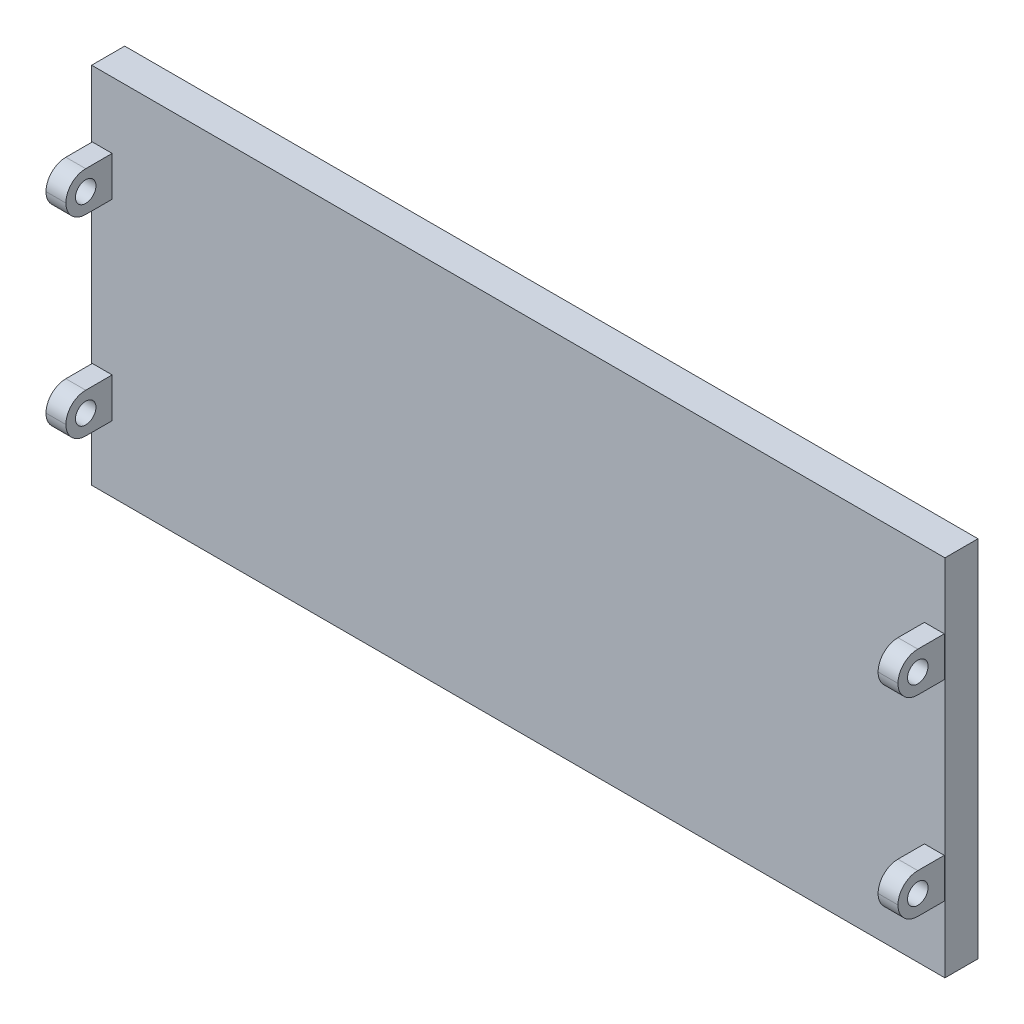
ISO-10303-21;
HEADER;
FILE_DESCRIPTION(('STEP AP214'),'2;1');
FILE_NAME('part.step','',(''),(''),'','','');
FILE_SCHEMA(('AUTOMOTIVE_DESIGN { 1 0 10303 214 1 1 1 1 }'));
ENDSEC;
DATA;
#1=APPLICATION_CONTEXT('core data for automotive mechanical design processes');
#2=APPLICATION_PROTOCOL_DEFINITION('international standard','automotive_design',2000,#1);
#3=PRODUCT_CONTEXT('',#1,'mechanical');
#4=PRODUCT('Part','Part','',(#3));
#5=PRODUCT_RELATED_PRODUCT_CATEGORY('part','',(#4));
#6=PRODUCT_DEFINITION_FORMATION('','',#4);
#7=PRODUCT_DEFINITION_CONTEXT('part definition',#1,'design');
#8=PRODUCT_DEFINITION('design','',#6,#7);
#9=PRODUCT_DEFINITION_SHAPE('','',#8);
#10=(LENGTH_UNIT() NAMED_UNIT(*) SI_UNIT(.MILLI.,.METRE.));
#11=(NAMED_UNIT(*) PLANE_ANGLE_UNIT() SI_UNIT($,.RADIAN.));
#12=(NAMED_UNIT(*) SI_UNIT($,.STERADIAN.) SOLID_ANGLE_UNIT());
#13=UNCERTAINTY_MEASURE_WITH_UNIT(LENGTH_MEASURE(1.E-05),#10,'distance_accuracy_value','');
#14=(GEOMETRIC_REPRESENTATION_CONTEXT(3) GLOBAL_UNCERTAINTY_ASSIGNED_CONTEXT((#13)) GLOBAL_UNIT_ASSIGNED_CONTEXT((#10,
#11,#12)) REPRESENTATION_CONTEXT('',''));
#15=CARTESIAN_POINT('',(0.,0.,0.));
#16=DIRECTION('',(0.,0.,1.));
#17=DIRECTION('',(1.,0.,0.));
#18=AXIS2_PLACEMENT_3D('',#15,#16,#17);
#19=CARTESIAN_POINT('',(225.,0.,0.));
#20=DIRECTION('',(-1.,0.,0.));
#21=DIRECTION('',(0.,0.,1.));
#22=AXIS2_PLACEMENT_3D('',#19,#20,#21);
#23=PLANE('',#22);
#24=DIRECTION('',(0.,0.,1.));
#25=VECTOR('',#24,1.);
#26=CARTESIAN_POINT('',(225.,0.,-4.99999999999999));
#27=LINE('',#26,#25);
#28=CARTESIAN_POINT('',(225.,0.,-4.99999999999999));
#29=VERTEX_POINT('',#28);
#30=CARTESIAN_POINT('',(225.,0.,0.));
#31=VERTEX_POINT('',#30);
#32=EDGE_CURVE('E207',#29,#31,#27,.T.);
#33=ORIENTED_EDGE('',*,*,#32,.T.);
#34=DIRECTION('',(0.,1.,0.));
#35=VECTOR('',#34,1.);
#36=CARTESIAN_POINT('',(225.,0.,0.));
#37=LINE('',#36,#35);
#38=CARTESIAN_POINT('',(225.,55.,0.));
#39=VERTEX_POINT('',#38);
#40=EDGE_CURVE('E41',#31,#39,#37,.T.);
#41=ORIENTED_EDGE('',*,*,#40,.T.);
#42=DIRECTION('',(0.,0.,-1.));
#43=VECTOR('',#42,1.);
#44=CARTESIAN_POINT('',(225.,55.,0.));
#45=LINE('',#44,#43);
#46=CARTESIAN_POINT('',(225.,55.,-4.99999999999998));
#47=VERTEX_POINT('',#46);
#48=EDGE_CURVE('E234',#39,#47,#45,.T.);
#49=ORIENTED_EDGE('',*,*,#48,.T.);
#50=DIRECTION('',(0.,-1.,0.));
#51=VECTOR('',#50,1.);
#52=CARTESIAN_POINT('',(225.,55.,-4.99999999999998));
#53=LINE('',#52,#51);
#54=EDGE_CURVE('E220',#47,#29,#53,.T.);
#55=ORIENTED_EDGE('',*,*,#54,.T.);
#56=EDGE_LOOP('',(#33,#41,#49,#55));
#57=FACE_BOUND('',#56,.T.);
#58=ADVANCED_FACE('F37',(#57),#23,.T.);
#59=CARTESIAN_POINT('',(354.,0.,0.));
#60=DIRECTION('',(1.,0.,0.));
#61=DIRECTION('',(0.,1.,0.));
#62=AXIS2_PLACEMENT_3D('',#59,#60,#61);
#63=PLANE('',#62);
#64=DIRECTION('',(0.,0.,1.));
#65=VECTOR('',#64,1.);
#66=CARTESIAN_POINT('',(354.,55.,0.));
#67=LINE('',#66,#65);
#68=CARTESIAN_POINT('',(354.,55.,-4.99999999999998));
#69=VERTEX_POINT('',#68);
#70=CARTESIAN_POINT('',(354.,55.,0.));
#71=VERTEX_POINT('',#70);
#72=EDGE_CURVE('E232',#69,#71,#67,.T.);
#73=ORIENTED_EDGE('',*,*,#72,.T.);
#74=DIRECTION('',(0.,-1.,0.));
#75=VECTOR('',#74,1.);
#76=CARTESIAN_POINT('',(354.,0.,0.));
#77=LINE('',#76,#75);
#78=CARTESIAN_POINT('',(354.,0.,0.));
#79=VERTEX_POINT('',#78);
#80=EDGE_CURVE('E225',#71,#79,#77,.T.);
#81=ORIENTED_EDGE('',*,*,#80,.T.);
#82=DIRECTION('',(0.,0.,-1.));
#83=VECTOR('',#82,1.);
#84=CARTESIAN_POINT('',(354.,0.,-4.99999999999999));
#85=LINE('',#84,#83);
#86=CARTESIAN_POINT('',(354.,0.,-4.99999999999999));
#87=VERTEX_POINT('',#86);
#88=EDGE_CURVE('E205',#79,#87,#85,.T.);
#89=ORIENTED_EDGE('',*,*,#88,.T.);
#90=DIRECTION('',(0.,1.,0.));
#91=VECTOR('',#90,1.);
#92=CARTESIAN_POINT('',(354.,55.,-4.99999999999998));
#93=LINE('',#92,#91);
#94=EDGE_CURVE('E215',#87,#69,#93,.T.);
#95=ORIENTED_EDGE('',*,*,#94,.T.);
#96=EDGE_LOOP('',(#73,#81,#89,#95));
#97=FACE_BOUND('',#96,.T.);
#98=ADVANCED_FACE('F223',(#97),#63,.T.);
#99=CARTESIAN_POINT('',(129.,42.,4.));
#100=DIRECTION('',(1.,0.,0.));
#101=DIRECTION('',(0.,0.,-1.));
#102=AXIS2_PLACEMENT_3D('',#99,#100,#101);
#103=CYLINDRICAL_SURFACE('',#102,3.);
#104=DIRECTION('',(-1.,0.,0.));
#105=VECTOR('',#104,1.);
#106=CARTESIAN_POINT('',(353.9,45.,4.));
#107=LINE('',#106,#105);
#108=CARTESIAN_POINT('',(350.9,45.,4.));
#109=VERTEX_POINT('',#108);
#110=CARTESIAN_POINT('',(353.9,45.,4.));
#111=VERTEX_POINT('',#110);
#112=EDGE_CURVE('E251',#109,#111,#107,.F.);
#113=ORIENTED_EDGE('',*,*,#112,.F.);
#114=CARTESIAN_POINT('',(350.9,42.,4.));
#115=DIRECTION('',(1.,0.,0.));
#116=DIRECTION('',(0.,0.,-1.));
#117=AXIS2_PLACEMENT_3D('',#114,#115,#116);
#118=CIRCLE('',#117,3.);
#119=CARTESIAN_POINT('',(350.9,42.,7.));
#120=VERTEX_POINT('',#119);
#121=EDGE_CURVE('E257',#120,#109,#118,.F.);
#122=ORIENTED_EDGE('',*,*,#121,.F.);
#123=DIRECTION('',(-1.,0.,0.));
#124=VECTOR('',#123,1.);
#125=CARTESIAN_POINT('',(350.9,42.,7.));
#126=LINE('',#125,#124);
#127=CARTESIAN_POINT('',(353.9,42.,7.));
#128=VERTEX_POINT('',#127);
#129=EDGE_CURVE('E11',#128,#120,#126,.T.);
#130=ORIENTED_EDGE('',*,*,#129,.F.);
#131=CARTESIAN_POINT('',(353.9,42.,4.));
#132=DIRECTION('',(-1.,0.,0.));
#133=DIRECTION('',(0.,0.,1.));
#134=AXIS2_PLACEMENT_3D('',#131,#132,#133);
#135=CIRCLE('',#134,3.);
#136=EDGE_CURVE('E267',#111,#128,#135,.F.);
#137=ORIENTED_EDGE('',*,*,#136,.F.);
#138=EDGE_LOOP('',(#113,#122,#130,#137));
#139=FACE_BOUND('',#138,.T.);
#140=ADVANCED_FACE('F439',(#139),#103,.T.);
#141=CARTESIAN_POINT('',(129.,42.,4.));
#142=DIRECTION('',(-1.,0.,0.));
#143=DIRECTION('',(0.,0.,1.));
#144=AXIS2_PLACEMENT_3D('',#141,#142,#143);
#145=CYLINDRICAL_SURFACE('',#144,3.);
#146=CARTESIAN_POINT('',(350.9,42.,4.));
#147=DIRECTION('',(1.,0.,0.));
#148=DIRECTION('',(0.,0.,-1.));
#149=AXIS2_PLACEMENT_3D('',#146,#147,#148);
#150=CIRCLE('',#149,3.);
#151=CARTESIAN_POINT('',(350.9,39.,4.));
#152=VERTEX_POINT('',#151);
#153=EDGE_CURVE('E252',#152,#120,#150,.F.);
#154=ORIENTED_EDGE('',*,*,#153,.F.);
#155=DIRECTION('',(1.,0.,0.));
#156=VECTOR('',#155,1.);
#157=CARTESIAN_POINT('',(350.9,39.,4.));
#158=LINE('',#157,#156);
#159=CARTESIAN_POINT('',(353.9,39.,4.));
#160=VERTEX_POINT('',#159);
#161=EDGE_CURVE('E262',#160,#152,#158,.F.);
#162=ORIENTED_EDGE('',*,*,#161,.F.);
#163=CARTESIAN_POINT('',(353.9,42.,4.));
#164=DIRECTION('',(-1.,0.,0.));
#165=DIRECTION('',(0.,0.,1.));
#166=AXIS2_PLACEMENT_3D('',#163,#164,#165);
#167=CIRCLE('',#166,3.);
#168=EDGE_CURVE('E265',#128,#160,#167,.F.);
#169=ORIENTED_EDGE('',*,*,#168,.F.);
#170=ORIENTED_EDGE('',*,*,#129,.T.);
#171=EDGE_LOOP('',(#154,#162,#169,#170));
#172=FACE_BOUND('',#171,.T.);
#173=ADVANCED_FACE('F436',(#172),#145,.T.);
#174=CARTESIAN_POINT('',(357.9,42.,4.));
#175=DIRECTION('',(-1.,0.,0.));
#176=DIRECTION('',(0.,-1.,0.));
#177=AXIS2_PLACEMENT_3D('',#174,#175,#176);
#178=CYLINDRICAL_SURFACE('',#177,1.55);
#179=CARTESIAN_POINT('',(350.9,42.,4.));
#180=DIRECTION('',(-1.,0.,0.));
#181=DIRECTION('',(0.,0.,1.));
#182=AXIS2_PLACEMENT_3D('',#179,#180,#181);
#183=CIRCLE('',#182,1.55);
#184=CARTESIAN_POINT('',(350.9,42.,5.55));
#185=VERTEX_POINT('',#184);
#186=EDGE_CURVE('E229',#185,#185,#183,.T.);
#187=ORIENTED_EDGE('',*,*,#186,.T.);
#188=EDGE_LOOP('',(#187));
#189=FACE_BOUND('',#188,.T.);
#190=CARTESIAN_POINT('',(353.9,42.,4.));
#191=DIRECTION('',(-1.,0.,0.));
#192=DIRECTION('',(0.,0.,1.));
#193=AXIS2_PLACEMENT_3D('',#190,#191,#192);
#194=CIRCLE('',#193,1.55);
#195=CARTESIAN_POINT('',(353.9,42.,5.55));
#196=VERTEX_POINT('',#195);
#197=EDGE_CURVE('E283',#196,#196,#194,.T.);
#198=ORIENTED_EDGE('',*,*,#197,.F.);
#199=EDGE_LOOP('',(#198));
#200=FACE_BOUND('',#199,.T.);
#201=ADVANCED_FACE('F413',(#189,#200),#178,.F.);
#202=CARTESIAN_POINT('',(228.1,13.,4.));
#203=DIRECTION('',(-1.,0.,0.));
#204=DIRECTION('',(0.,0.,1.));
#205=AXIS2_PLACEMENT_3D('',#202,#203,#204);
#206=CYLINDRICAL_SURFACE('',#205,3.);
#207=CARTESIAN_POINT('',(228.1,13.,4.));
#208=DIRECTION('',(1.,0.,0.));
#209=DIRECTION('',(0.,0.,-1.));
#210=AXIS2_PLACEMENT_3D('',#207,#208,#209);
#211=CIRCLE('',#210,3.);
#212=CARTESIAN_POINT('',(228.1,13.,7.));
#213=VERTEX_POINT('',#212);
#214=CARTESIAN_POINT('',(228.1,10.,4.));
#215=VERTEX_POINT('',#214);
#216=EDGE_CURVE('E312',#213,#215,#211,.T.);
#217=ORIENTED_EDGE('',*,*,#216,.F.);
#218=DIRECTION('',(1.,0.,0.));
#219=VECTOR('',#218,1.);
#220=CARTESIAN_POINT('',(450.,13.,7.));
#221=LINE('',#220,#219);
#222=CARTESIAN_POINT('',(225.1,13.,7.));
#223=VERTEX_POINT('',#222);
#224=EDGE_CURVE('E294',#213,#223,#221,.F.);
#225=ORIENTED_EDGE('',*,*,#224,.T.);
#226=CARTESIAN_POINT('',(225.1,13.,4.));
#227=DIRECTION('',(-1.,0.,0.));
#228=DIRECTION('',(0.,0.,1.));
#229=AXIS2_PLACEMENT_3D('',#226,#227,#228);
#230=CIRCLE('',#229,3.);
#231=CARTESIAN_POINT('',(225.1,10.,4.));
#232=VERTEX_POINT('',#231);
#233=EDGE_CURVE('E316',#232,#223,#230,.T.);
#234=ORIENTED_EDGE('',*,*,#233,.F.);
#235=DIRECTION('',(-1.,0.,0.));
#236=VECTOR('',#235,1.);
#237=CARTESIAN_POINT('',(228.1,10.,4.));
#238=LINE('',#237,#236);
#239=EDGE_CURVE('E240',#215,#232,#238,.T.);
#240=ORIENTED_EDGE('',*,*,#239,.F.);
#241=EDGE_LOOP('',(#217,#225,#234,#240));
#242=FACE_BOUND('',#241,.T.);
#243=ADVANCED_FACE('F480',(#242),#206,.T.);
#244=CARTESIAN_POINT('',(221.1,13.,4.));
#245=DIRECTION('',(1.,0.,0.));
#246=DIRECTION('',(0.,0.,-1.));
#247=AXIS2_PLACEMENT_3D('',#244,#245,#246);
#248=CYLINDRICAL_SURFACE('',#247,1.55);
#249=CARTESIAN_POINT('',(225.1,13.,4.));
#250=DIRECTION('',(-1.,0.,0.));
#251=DIRECTION('',(0.,0.,1.));
#252=AXIS2_PLACEMENT_3D('',#249,#250,#251);
#253=CIRCLE('',#252,1.55);
#254=CARTESIAN_POINT('',(225.1,13.,5.55));
#255=VERTEX_POINT('',#254);
#256=EDGE_CURVE('E325',#255,#255,#253,.F.);
#257=ORIENTED_EDGE('',*,*,#256,.F.);
#258=EDGE_LOOP('',(#257));
#259=FACE_BOUND('',#258,.T.);
#260=CARTESIAN_POINT('',(228.1,13.,4.));
#261=DIRECTION('',(-1.,0.,0.));
#262=DIRECTION('',(0.,0.,1.));
#263=AXIS2_PLACEMENT_3D('',#260,#261,#262);
#264=CIRCLE('',#263,1.55);
#265=CARTESIAN_POINT('',(228.1,13.,5.55));
#266=VERTEX_POINT('',#265);
#267=EDGE_CURVE('E297',#266,#266,#264,.T.);
#268=ORIENTED_EDGE('',*,*,#267,.F.);
#269=EDGE_LOOP('',(#268));
#270=FACE_BOUND('',#269,.T.);
#271=ADVANCED_FACE('F478',(#259,#270),#248,.F.);
#272=CARTESIAN_POINT('',(228.1,13.,4.));
#273=DIRECTION('',(1.,0.,0.));
#274=DIRECTION('',(0.,0.,-1.));
#275=AXIS2_PLACEMENT_3D('',#272,#273,#274);
#276=CYLINDRICAL_SURFACE('',#275,3.);
#277=ORIENTED_EDGE('',*,*,#224,.F.);
#278=CARTESIAN_POINT('',(228.1,13.,4.));
#279=DIRECTION('',(1.,0.,0.));
#280=DIRECTION('',(0.,0.,-1.));
#281=AXIS2_PLACEMENT_3D('',#278,#279,#280);
#282=CIRCLE('',#281,3.);
#283=CARTESIAN_POINT('',(228.1,16.,4.));
#284=VERTEX_POINT('',#283);
#285=EDGE_CURVE('E314',#284,#213,#282,.T.);
#286=ORIENTED_EDGE('',*,*,#285,.F.);
#287=DIRECTION('',(1.,0.,0.));
#288=VECTOR('',#287,1.);
#289=CARTESIAN_POINT('',(228.1,16.,4.));
#290=LINE('',#289,#288);
#291=CARTESIAN_POINT('',(225.1,16.,4.));
#292=VERTEX_POINT('',#291);
#293=EDGE_CURVE('E310',#292,#284,#290,.T.);
#294=ORIENTED_EDGE('',*,*,#293,.F.);
#295=CARTESIAN_POINT('',(225.1,13.,4.));
#296=DIRECTION('',(-1.,0.,0.));
#297=DIRECTION('',(0.,0.,1.));
#298=AXIS2_PLACEMENT_3D('',#295,#296,#297);
#299=CIRCLE('',#298,3.);
#300=EDGE_CURVE('E318',#223,#292,#299,.T.);
#301=ORIENTED_EDGE('',*,*,#300,.F.);
#302=EDGE_LOOP('',(#277,#286,#294,#301));
#303=FACE_BOUND('',#302,.T.);
#304=ADVANCED_FACE('F474',(#303),#276,.T.);
#305=CARTESIAN_POINT('',(228.1,42.,4.));
#306=DIRECTION('',(-1.,0.,0.));
#307=DIRECTION('',(0.,0.,1.));
#308=AXIS2_PLACEMENT_3D('',#305,#306,#307);
#309=CYLINDRICAL_SURFACE('',#308,3.);
#310=CARTESIAN_POINT('',(228.1,42.,4.));
#311=DIRECTION('',(1.,0.,0.));
#312=DIRECTION('',(0.,0.,-1.));
#313=AXIS2_PLACEMENT_3D('',#310,#311,#312);
#314=CIRCLE('',#313,3.);
#315=CARTESIAN_POINT('',(228.1,42.,7.));
#316=VERTEX_POINT('',#315);
#317=CARTESIAN_POINT('',(228.1,39.,4.));
#318=VERTEX_POINT('',#317);
#319=EDGE_CURVE('E299',#316,#318,#314,.T.);
#320=ORIENTED_EDGE('',*,*,#319,.F.);
#321=DIRECTION('',(1.,0.,0.));
#322=VECTOR('',#321,1.);
#323=CARTESIAN_POINT('',(450.,42.,7.));
#324=LINE('',#323,#322);
#325=CARTESIAN_POINT('',(225.1,42.,7.));
#326=VERTEX_POINT('',#325);
#327=EDGE_CURVE('E290',#316,#326,#324,.F.);
#328=ORIENTED_EDGE('',*,*,#327,.T.);
#329=CARTESIAN_POINT('',(225.1,42.,4.));
#330=DIRECTION('',(-1.,0.,0.));
#331=DIRECTION('',(0.,0.,1.));
#332=AXIS2_PLACEMENT_3D('',#329,#330,#331);
#333=CIRCLE('',#332,3.);
#334=CARTESIAN_POINT('',(225.1,39.,4.));
#335=VERTEX_POINT('',#334);
#336=EDGE_CURVE('E303',#335,#326,#333,.T.);
#337=ORIENTED_EDGE('',*,*,#336,.F.);
#338=DIRECTION('',(-1.,0.,0.));
#339=VECTOR('',#338,1.);
#340=CARTESIAN_POINT('',(228.1,39.,4.));
#341=LINE('',#340,#339);
#342=EDGE_CURVE('E307',#318,#335,#341,.T.);
#343=ORIENTED_EDGE('',*,*,#342,.F.);
#344=EDGE_LOOP('',(#320,#328,#337,#343));
#345=FACE_BOUND('',#344,.T.);
#346=ADVANCED_FACE('F471',(#345),#309,.T.);
#347=CARTESIAN_POINT('',(221.1,42.,4.));
#348=DIRECTION('',(1.,0.,0.));
#349=DIRECTION('',(0.,0.,-1.));
#350=AXIS2_PLACEMENT_3D('',#347,#348,#349);
#351=CYLINDRICAL_SURFACE('',#350,1.55);
#352=CARTESIAN_POINT('',(225.1,42.,4.));
#353=DIRECTION('',(-1.,0.,0.));
#354=DIRECTION('',(0.,0.,1.));
#355=AXIS2_PLACEMENT_3D('',#352,#353,#354);
#356=CIRCLE('',#355,1.55);
#357=CARTESIAN_POINT('',(225.1,42.,5.55));
#358=VERTEX_POINT('',#357);
#359=EDGE_CURVE('E322',#358,#358,#356,.F.);
#360=ORIENTED_EDGE('',*,*,#359,.F.);
#361=EDGE_LOOP('',(#360));
#362=FACE_BOUND('',#361,.T.);
#363=CARTESIAN_POINT('',(228.1,42.,4.));
#364=DIRECTION('',(-1.,0.,0.));
#365=DIRECTION('',(0.,0.,1.));
#366=AXIS2_PLACEMENT_3D('',#363,#364,#365);
#367=CIRCLE('',#366,1.55);
#368=CARTESIAN_POINT('',(228.1,42.,5.55));
#369=VERTEX_POINT('',#368);
#370=EDGE_CURVE('E329',#369,#369,#367,.T.);
#371=ORIENTED_EDGE('',*,*,#370,.F.);
#372=EDGE_LOOP('',(#371));
#373=FACE_BOUND('',#372,.T.);
#374=ADVANCED_FACE('F469',(#362,#373),#351,.F.);
#375=CARTESIAN_POINT('',(228.1,42.,4.));
#376=DIRECTION('',(1.,0.,0.));
#377=DIRECTION('',(0.,0.,-1.));
#378=AXIS2_PLACEMENT_3D('',#375,#376,#377);
#379=CYLINDRICAL_SURFACE('',#378,3.);
#380=ORIENTED_EDGE('',*,*,#327,.F.);
#381=CARTESIAN_POINT('',(228.1,42.,4.));
#382=DIRECTION('',(1.,0.,0.));
#383=DIRECTION('',(0.,0.,-1.));
#384=AXIS2_PLACEMENT_3D('',#381,#382,#383);
#385=CIRCLE('',#384,3.);
#386=CARTESIAN_POINT('',(228.1,45.,4.));
#387=VERTEX_POINT('',#386);
#388=EDGE_CURVE('E301',#387,#316,#385,.T.);
#389=ORIENTED_EDGE('',*,*,#388,.F.);
#390=DIRECTION('',(1.,0.,0.));
#391=VECTOR('',#390,1.);
#392=CARTESIAN_POINT('',(228.1,45.,4.));
#393=LINE('',#392,#391);
#394=CARTESIAN_POINT('',(225.1,45.,4.));
#395=VERTEX_POINT('',#394);
#396=EDGE_CURVE('E282',#395,#387,#393,.T.);
#397=ORIENTED_EDGE('',*,*,#396,.F.);
#398=CARTESIAN_POINT('',(225.1,42.,4.));
#399=DIRECTION('',(-1.,0.,0.));
#400=DIRECTION('',(0.,0.,1.));
#401=AXIS2_PLACEMENT_3D('',#398,#399,#400);
#402=CIRCLE('',#401,3.);
#403=EDGE_CURVE('E305',#326,#395,#402,.T.);
#404=ORIENTED_EDGE('',*,*,#403,.F.);
#405=EDGE_LOOP('',(#380,#389,#397,#404));
#406=FACE_BOUND('',#405,.T.);
#407=ADVANCED_FACE('F461',(#406),#379,.T.);
#408=CARTESIAN_POINT('',(129.,13.,4.));
#409=DIRECTION('',(1.,0.,0.));
#410=DIRECTION('',(0.,0.,-1.));
#411=AXIS2_PLACEMENT_3D('',#408,#409,#410);
#412=CYLINDRICAL_SURFACE('',#411,3.);
#413=DIRECTION('',(-1.,0.,0.));
#414=VECTOR('',#413,1.);
#415=CARTESIAN_POINT('',(353.9,16.,4.));
#416=LINE('',#415,#414);
#417=CARTESIAN_POINT('',(350.9,16.,4.));
#418=VERTEX_POINT('',#417);
#419=CARTESIAN_POINT('',(353.9,16.,4.));
#420=VERTEX_POINT('',#419);
#421=EDGE_CURVE('E269',#418,#420,#416,.F.);
#422=ORIENTED_EDGE('',*,*,#421,.F.);
#423=CARTESIAN_POINT('',(350.9,13.,4.));
#424=DIRECTION('',(1.,0.,0.));
#425=DIRECTION('',(0.,0.,-1.));
#426=AXIS2_PLACEMENT_3D('',#423,#424,#425);
#427=CIRCLE('',#426,3.);
#428=CARTESIAN_POINT('',(350.9,13.,7.));
#429=VERTEX_POINT('',#428);
#430=EDGE_CURVE('E273',#429,#418,#427,.F.);
#431=ORIENTED_EDGE('',*,*,#430,.F.);
#432=DIRECTION('',(-1.,0.,0.));
#433=VECTOR('',#432,1.);
#434=CARTESIAN_POINT('',(350.9,13.,7.));
#435=LINE('',#434,#433);
#436=CARTESIAN_POINT('',(353.9,13.,7.));
#437=VERTEX_POINT('',#436);
#438=EDGE_CURVE('E46',#437,#429,#435,.T.);
#439=ORIENTED_EDGE('',*,*,#438,.F.);
#440=CARTESIAN_POINT('',(353.9,13.,4.));
#441=DIRECTION('',(-1.,0.,0.));
#442=DIRECTION('',(0.,0.,1.));
#443=AXIS2_PLACEMENT_3D('',#440,#441,#442);
#444=CIRCLE('',#443,3.);
#445=EDGE_CURVE('E280',#420,#437,#444,.F.);
#446=ORIENTED_EDGE('',*,*,#445,.F.);
#447=EDGE_LOOP('',(#422,#431,#439,#446));
#448=FACE_BOUND('',#447,.T.);
#449=ADVANCED_FACE('F457',(#448),#412,.T.);
#450=CARTESIAN_POINT('',(129.,13.,4.));
#451=DIRECTION('',(-1.,0.,0.));
#452=DIRECTION('',(0.,0.,1.));
#453=AXIS2_PLACEMENT_3D('',#450,#451,#452);
#454=CYLINDRICAL_SURFACE('',#453,3.);
#455=CARTESIAN_POINT('',(350.9,13.,4.));
#456=DIRECTION('',(1.,0.,0.));
#457=DIRECTION('',(0.,0.,-1.));
#458=AXIS2_PLACEMENT_3D('',#455,#456,#457);
#459=CIRCLE('',#458,3.);
#460=CARTESIAN_POINT('',(350.9,10.,4.));
#461=VERTEX_POINT('',#460);
#462=EDGE_CURVE('E271',#461,#429,#459,.F.);
#463=ORIENTED_EDGE('',*,*,#462,.F.);
#464=DIRECTION('',(1.,0.,0.));
#465=VECTOR('',#464,1.);
#466=CARTESIAN_POINT('',(350.9,10.,4.));
#467=LINE('',#466,#465);
#468=CARTESIAN_POINT('',(353.9,10.,4.));
#469=VERTEX_POINT('',#468);
#470=EDGE_CURVE('E275',#469,#461,#467,.F.);
#471=ORIENTED_EDGE('',*,*,#470,.F.);
#472=CARTESIAN_POINT('',(353.9,13.,4.));
#473=DIRECTION('',(-1.,0.,0.));
#474=DIRECTION('',(0.,0.,1.));
#475=AXIS2_PLACEMENT_3D('',#472,#473,#474);
#476=CIRCLE('',#475,3.);
#477=EDGE_CURVE('E278',#437,#469,#476,.F.);
#478=ORIENTED_EDGE('',*,*,#477,.F.);
#479=ORIENTED_EDGE('',*,*,#438,.T.);
#480=EDGE_LOOP('',(#463,#471,#478,#479));
#481=FACE_BOUND('',#480,.T.);
#482=ADVANCED_FACE('F460',(#481),#454,.T.);
#483=CARTESIAN_POINT('',(357.9,13.,4.));
#484=DIRECTION('',(-1.,0.,0.));
#485=DIRECTION('',(0.,-1.,0.));
#486=AXIS2_PLACEMENT_3D('',#483,#484,#485);
#487=CYLINDRICAL_SURFACE('',#486,1.55);
#488=CARTESIAN_POINT('',(350.9,13.,4.));
#489=DIRECTION('',(-1.,0.,0.));
#490=DIRECTION('',(0.,0.,1.));
#491=AXIS2_PLACEMENT_3D('',#488,#489,#490);
#492=CIRCLE('',#491,1.55);
#493=CARTESIAN_POINT('',(350.9,13.,5.55));
#494=VERTEX_POINT('',#493);
#495=EDGE_CURVE('E405',#494,#494,#492,.T.);
#496=ORIENTED_EDGE('',*,*,#495,.T.);
#497=EDGE_LOOP('',(#496));
#498=FACE_BOUND('',#497,.T.);
#499=CARTESIAN_POINT('',(353.9,13.,4.));
#500=DIRECTION('',(-1.,0.,0.));
#501=DIRECTION('',(0.,0.,1.));
#502=AXIS2_PLACEMENT_3D('',#499,#500,#501);
#503=CIRCLE('',#502,1.55);
#504=CARTESIAN_POINT('',(353.9,13.,5.55));
#505=VERTEX_POINT('',#504);
#506=EDGE_CURVE('E286',#505,#505,#503,.T.);
#507=ORIENTED_EDGE('',*,*,#506,.F.);
#508=EDGE_LOOP('',(#507));
#509=FACE_BOUND('',#508,.T.);
#510=ADVANCED_FACE('F465',(#498,#509),#487,.F.);
#511=CARTESIAN_POINT('',(350.9,39.,7.));
#512=DIRECTION('',(0.,1.,0.));
#513=DIRECTION('',(0.,0.,1.));
#514=AXIS2_PLACEMENT_3D('',#511,#512,#513);
#515=PLANE('',#514);
#516=DIRECTION('',(0.,0.,-1.));
#517=VECTOR('',#516,1.);
#518=CARTESIAN_POINT('',(353.9,39.,7.));
#519=LINE('',#518,#517);
#520=CARTESIAN_POINT('',(353.9,39.,0.));
#521=VERTEX_POINT('',#520);
#522=EDGE_CURVE('E373',#160,#521,#519,.T.);
#523=ORIENTED_EDGE('',*,*,#522,.F.);
#524=ORIENTED_EDGE('',*,*,#161,.T.);
#525=DIRECTION('',(0.,0.,-1.));
#526=VECTOR('',#525,1.);
#527=CARTESIAN_POINT('',(350.9,39.,7.));
#528=LINE('',#527,#526);
#529=CARTESIAN_POINT('',(350.9,39.,0.));
#530=VERTEX_POINT('',#529);
#531=EDGE_CURVE('E293',#152,#530,#528,.T.);
#532=ORIENTED_EDGE('',*,*,#531,.T.);
#533=DIRECTION('',(1.,0.,0.));
#534=VECTOR('',#533,1.);
#535=CARTESIAN_POINT('',(350.9,39.,0.));
#536=LINE('',#535,#534);
#537=EDGE_CURVE('E384',#530,#521,#536,.T.);
#538=ORIENTED_EDGE('',*,*,#537,.T.);
#539=EDGE_LOOP('',(#523,#524,#532,#538));
#540=FACE_BOUND('',#539,.T.);
#541=ADVANCED_FACE('F426',(#540),#515,.F.);
#542=CARTESIAN_POINT('',(353.9,45.,7.));
#543=DIRECTION('',(-1.,0.,0.));
#544=DIRECTION('',(0.,0.,1.));
#545=AXIS2_PLACEMENT_3D('',#542,#543,#544);
#546=PLANE('',#545);
#547=ORIENTED_EDGE('',*,*,#197,.T.);
#548=EDGE_LOOP('',(#547));
#549=FACE_BOUND('',#548,.T.);
#550=ORIENTED_EDGE('',*,*,#136,.T.);
#551=ORIENTED_EDGE('',*,*,#168,.T.);
#552=ORIENTED_EDGE('',*,*,#522,.T.);
#553=DIRECTION('',(0.,1.,0.));
#554=VECTOR('',#553,1.);
#555=CARTESIAN_POINT('',(353.9,45.,0.));
#556=LINE('',#555,#554);
#557=CARTESIAN_POINT('',(353.9,45.,0.));
#558=VERTEX_POINT('',#557);
#559=EDGE_CURVE('E381',#521,#558,#556,.T.);
#560=ORIENTED_EDGE('',*,*,#559,.T.);
#561=DIRECTION('',(0.,0.,-1.));
#562=VECTOR('',#561,1.);
#563=CARTESIAN_POINT('',(353.9,45.,7.));
#564=LINE('',#563,#562);
#565=EDGE_CURVE('E375',#111,#558,#564,.T.);
#566=ORIENTED_EDGE('',*,*,#565,.F.);
#567=EDGE_LOOP('',(#550,#551,#552,#560,#566));
#568=FACE_BOUND('',#567,.T.);
#569=ADVANCED_FACE('F432',(#549,#568),#546,.F.);
#570=CARTESIAN_POINT('',(350.9,45.,7.));
#571=DIRECTION('',(0.,-1.,0.));
#572=DIRECTION('',(0.,0.,-1.));
#573=AXIS2_PLACEMENT_3D('',#570,#571,#572);
#574=PLANE('',#573);
#575=DIRECTION('',(0.,0.,-1.));
#576=VECTOR('',#575,1.);
#577=CARTESIAN_POINT('',(350.9,45.,7.));
#578=LINE('',#577,#576);
#579=CARTESIAN_POINT('',(350.9,45.,0.));
#580=VERTEX_POINT('',#579);
#581=EDGE_CURVE('E62',#109,#580,#578,.T.);
#582=ORIENTED_EDGE('',*,*,#581,.F.);
#583=ORIENTED_EDGE('',*,*,#112,.T.);
#584=ORIENTED_EDGE('',*,*,#565,.T.);
#585=DIRECTION('',(-1.,0.,0.));
#586=VECTOR('',#585,1.);
#587=CARTESIAN_POINT('',(350.9,45.,0.));
#588=LINE('',#587,#586);
#589=EDGE_CURVE('E378',#558,#580,#588,.T.);
#590=ORIENTED_EDGE('',*,*,#589,.T.);
#591=EDGE_LOOP('',(#582,#583,#584,#590));
#592=FACE_BOUND('',#591,.T.);
#593=ADVANCED_FACE('F419',(#592),#574,.F.);
#594=CARTESIAN_POINT('',(350.9,45.,7.));
#595=DIRECTION('',(1.,0.,0.));
#596=DIRECTION('',(0.,0.,-1.));
#597=AXIS2_PLACEMENT_3D('',#594,#595,#596);
#598=PLANE('',#597);
#599=ORIENTED_EDGE('',*,*,#186,.F.);
#600=EDGE_LOOP('',(#599));
#601=FACE_BOUND('',#600,.T.);
#602=ORIENTED_EDGE('',*,*,#531,.F.);
#603=ORIENTED_EDGE('',*,*,#153,.T.);
#604=ORIENTED_EDGE('',*,*,#121,.T.);
#605=ORIENTED_EDGE('',*,*,#581,.T.);
#606=DIRECTION('',(0.,-1.,0.));
#607=VECTOR('',#606,1.);
#608=CARTESIAN_POINT('',(350.9,45.,0.));
#609=LINE('',#608,#607);
#610=EDGE_CURVE('E387',#580,#530,#609,.T.);
#611=ORIENTED_EDGE('',*,*,#610,.T.);
#612=EDGE_LOOP('',(#602,#603,#604,#605,#611));
#613=FACE_BOUND('',#612,.T.);
#614=ADVANCED_FACE('F416',(#601,#613),#598,.F.);
#615=CARTESIAN_POINT('',(225.1,16.,7.));
#616=DIRECTION('',(-1.,0.,0.));
#617=DIRECTION('',(0.,0.,1.));
#618=AXIS2_PLACEMENT_3D('',#615,#616,#617);
#619=PLANE('',#618);
#620=ORIENTED_EDGE('',*,*,#256,.T.);
#621=EDGE_LOOP('',(#620));
#622=FACE_BOUND('',#621,.T.);
#623=DIRECTION('',(0.,0.,-1.));
#624=VECTOR('',#623,1.);
#625=CARTESIAN_POINT('',(225.1,10.,7.));
#626=LINE('',#625,#624);
#627=CARTESIAN_POINT('',(225.1,10.,0.));
#628=VERTEX_POINT('',#627);
#629=EDGE_CURVE('E353',#232,#628,#626,.T.);
#630=ORIENTED_EDGE('',*,*,#629,.F.);
#631=ORIENTED_EDGE('',*,*,#233,.T.);
#632=ORIENTED_EDGE('',*,*,#300,.T.);
#633=DIRECTION('',(0.,0.,-1.));
#634=VECTOR('',#633,1.);
#635=CARTESIAN_POINT('',(225.1,16.,7.));
#636=LINE('',#635,#634);
#637=CARTESIAN_POINT('',(225.1,16.,0.));
#638=VERTEX_POINT('',#637);
#639=EDGE_CURVE('E351',#292,#638,#636,.T.);
#640=ORIENTED_EDGE('',*,*,#639,.T.);
#641=DIRECTION('',(0.,1.,0.));
#642=VECTOR('',#641,1.);
#643=CARTESIAN_POINT('',(225.1,16.,0.));
#644=LINE('',#643,#642);
#645=EDGE_CURVE('E360',#628,#638,#644,.T.);
#646=ORIENTED_EDGE('',*,*,#645,.F.);
#647=EDGE_LOOP('',(#630,#631,#632,#640,#646));
#648=FACE_BOUND('',#647,.T.);
#649=ADVANCED_FACE('F418',(#622,#648),#619,.T.);
#650=CARTESIAN_POINT('',(228.1,10.,7.));
#651=DIRECTION('',(0.,-1.,0.));
#652=DIRECTION('',(0.,0.,-1.));
#653=AXIS2_PLACEMENT_3D('',#650,#651,#652);
#654=PLANE('',#653);
#655=DIRECTION('',(0.,0.,-1.));
#656=VECTOR('',#655,1.);
#657=CARTESIAN_POINT('',(228.1,10.,7.));
#658=LINE('',#657,#656);
#659=CARTESIAN_POINT('',(228.1,10.,0.));
#660=VERTEX_POINT('',#659);
#661=EDGE_CURVE('E355',#215,#660,#658,.T.);
#662=ORIENTED_EDGE('',*,*,#661,.F.);
#663=ORIENTED_EDGE('',*,*,#239,.T.);
#664=ORIENTED_EDGE('',*,*,#629,.T.);
#665=DIRECTION('',(-1.,0.,0.));
#666=VECTOR('',#665,1.);
#667=CARTESIAN_POINT('',(228.1,10.,0.));
#668=LINE('',#667,#666);
#669=EDGE_CURVE('E357',#660,#628,#668,.T.);
#670=ORIENTED_EDGE('',*,*,#669,.F.);
#671=EDGE_LOOP('',(#662,#663,#664,#670));
#672=FACE_BOUND('',#671,.T.);
#673=ADVANCED_FACE('F505',(#672),#654,.T.);
#674=CARTESIAN_POINT('',(228.1,16.,7.));
#675=DIRECTION('',(1.,0.,0.));
#676=DIRECTION('',(0.,0.,-1.));
#677=AXIS2_PLACEMENT_3D('',#674,#675,#676);
#678=PLANE('',#677);
#679=ORIENTED_EDGE('',*,*,#267,.T.);
#680=EDGE_LOOP('',(#679));
#681=FACE_BOUND('',#680,.T.);
#682=ORIENTED_EDGE('',*,*,#285,.T.);
#683=ORIENTED_EDGE('',*,*,#216,.T.);
#684=ORIENTED_EDGE('',*,*,#661,.T.);
#685=DIRECTION('',(0.,-1.,0.));
#686=VECTOR('',#685,1.);
#687=CARTESIAN_POINT('',(228.1,16.,0.));
#688=LINE('',#687,#686);
#689=CARTESIAN_POINT('',(228.1,16.,0.));
#690=VERTEX_POINT('',#689);
#691=EDGE_CURVE('E326',#690,#660,#688,.T.);
#692=ORIENTED_EDGE('',*,*,#691,.F.);
#693=DIRECTION('',(0.,0.,-1.));
#694=VECTOR('',#693,1.);
#695=CARTESIAN_POINT('',(228.1,16.,7.));
#696=LINE('',#695,#694);
#697=EDGE_CURVE('E349',#284,#690,#696,.T.);
#698=ORIENTED_EDGE('',*,*,#697,.F.);
#699=EDGE_LOOP('',(#682,#683,#684,#692,#698));
#700=FACE_BOUND('',#699,.T.);
#701=ADVANCED_FACE('F502',(#681,#700),#678,.T.);
#702=CARTESIAN_POINT('',(228.1,16.,7.));
#703=DIRECTION('',(0.,1.,0.));
#704=DIRECTION('',(0.,0.,1.));
#705=AXIS2_PLACEMENT_3D('',#702,#703,#704);
#706=PLANE('',#705);
#707=ORIENTED_EDGE('',*,*,#639,.F.);
#708=ORIENTED_EDGE('',*,*,#293,.T.);
#709=ORIENTED_EDGE('',*,*,#697,.T.);
#710=DIRECTION('',(1.,0.,0.));
#711=VECTOR('',#710,1.);
#712=CARTESIAN_POINT('',(228.1,16.,0.));
#713=LINE('',#712,#711);
#714=EDGE_CURVE('E363',#638,#690,#713,.T.);
#715=ORIENTED_EDGE('',*,*,#714,.F.);
#716=EDGE_LOOP('',(#707,#708,#709,#715));
#717=FACE_BOUND('',#716,.T.);
#718=ADVANCED_FACE('F497',(#717),#706,.T.);
#719=CARTESIAN_POINT('',(225.1,45.,7.));
#720=DIRECTION('',(-1.,0.,0.));
#721=DIRECTION('',(0.,0.,1.));
#722=AXIS2_PLACEMENT_3D('',#719,#720,#721);
#723=PLANE('',#722);
#724=ORIENTED_EDGE('',*,*,#359,.T.);
#725=EDGE_LOOP('',(#724));
#726=FACE_BOUND('',#725,.T.);
#727=DIRECTION('',(0.,0.,-1.));
#728=VECTOR('',#727,1.);
#729=CARTESIAN_POINT('',(225.1,39.,7.));
#730=LINE('',#729,#728);
#731=CARTESIAN_POINT('',(225.1,39.,0.));
#732=VERTEX_POINT('',#731);
#733=EDGE_CURVE('E333',#335,#732,#730,.T.);
#734=ORIENTED_EDGE('',*,*,#733,.F.);
#735=ORIENTED_EDGE('',*,*,#336,.T.);
#736=ORIENTED_EDGE('',*,*,#403,.T.);
#737=DIRECTION('',(0.,0.,-1.));
#738=VECTOR('',#737,1.);
#739=CARTESIAN_POINT('',(225.1,45.,7.));
#740=LINE('',#739,#738);
#741=CARTESIAN_POINT('',(225.1,45.,0.));
#742=VERTEX_POINT('',#741);
#743=EDGE_CURVE('E331',#395,#742,#740,.T.);
#744=ORIENTED_EDGE('',*,*,#743,.T.);
#745=DIRECTION('',(0.,1.,0.));
#746=VECTOR('',#745,1.);
#747=CARTESIAN_POINT('',(225.1,45.,0.));
#748=LINE('',#747,#746);
#749=EDGE_CURVE('E340',#732,#742,#748,.T.);
#750=ORIENTED_EDGE('',*,*,#749,.F.);
#751=EDGE_LOOP('',(#734,#735,#736,#744,#750));
#752=FACE_BOUND('',#751,.T.);
#753=ADVANCED_FACE('F494',(#726,#752),#723,.T.);
#754=CARTESIAN_POINT('',(228.1,39.,7.));
#755=DIRECTION('',(0.,-1.,0.));
#756=DIRECTION('',(0.,0.,-1.));
#757=AXIS2_PLACEMENT_3D('',#754,#755,#756);
#758=PLANE('',#757);
#759=DIRECTION('',(0.,0.,-1.));
#760=VECTOR('',#759,1.);
#761=CARTESIAN_POINT('',(228.1,39.,7.));
#762=LINE('',#761,#760);
#763=CARTESIAN_POINT('',(228.1,39.,0.));
#764=VERTEX_POINT('',#763);
#765=EDGE_CURVE('E335',#318,#764,#762,.T.);
#766=ORIENTED_EDGE('',*,*,#765,.F.);
#767=ORIENTED_EDGE('',*,*,#342,.T.);
#768=ORIENTED_EDGE('',*,*,#733,.T.);
#769=DIRECTION('',(-1.,0.,0.));
#770=VECTOR('',#769,1.);
#771=CARTESIAN_POINT('',(228.1,39.,0.));
#772=LINE('',#771,#770);
#773=EDGE_CURVE('E337',#764,#732,#772,.T.);
#774=ORIENTED_EDGE('',*,*,#773,.F.);
#775=EDGE_LOOP('',(#766,#767,#768,#774));
#776=FACE_BOUND('',#775,.T.);
#777=ADVANCED_FACE('F488',(#776),#758,.T.);
#778=CARTESIAN_POINT('',(228.1,45.,7.));
#779=DIRECTION('',(1.,0.,0.));
#780=DIRECTION('',(0.,0.,-1.));
#781=AXIS2_PLACEMENT_3D('',#778,#779,#780);
#782=PLANE('',#781);
#783=ORIENTED_EDGE('',*,*,#370,.T.);
#784=EDGE_LOOP('',(#783));
#785=FACE_BOUND('',#784,.T.);
#786=ORIENTED_EDGE('',*,*,#388,.T.);
#787=ORIENTED_EDGE('',*,*,#319,.T.);
#788=ORIENTED_EDGE('',*,*,#765,.T.);
#789=DIRECTION('',(0.,-1.,0.));
#790=VECTOR('',#789,1.);
#791=CARTESIAN_POINT('',(228.1,45.,0.));
#792=LINE('',#791,#790);
#793=CARTESIAN_POINT('',(228.1,45.,0.));
#794=VERTEX_POINT('',#793);
#795=EDGE_CURVE('E346',#794,#764,#792,.T.);
#796=ORIENTED_EDGE('',*,*,#795,.F.);
#797=DIRECTION('',(0.,0.,-1.));
#798=VECTOR('',#797,1.);
#799=CARTESIAN_POINT('',(228.1,45.,7.));
#800=LINE('',#799,#798);
#801=EDGE_CURVE('E238',#387,#794,#800,.T.);
#802=ORIENTED_EDGE('',*,*,#801,.F.);
#803=EDGE_LOOP('',(#786,#787,#788,#796,#802));
#804=FACE_BOUND('',#803,.T.);
#805=ADVANCED_FACE('F484',(#785,#804),#782,.T.);
#806=CARTESIAN_POINT('',(228.1,45.,7.));
#807=DIRECTION('',(0.,1.,0.));
#808=DIRECTION('',(0.,0.,1.));
#809=AXIS2_PLACEMENT_3D('',#806,#807,#808);
#810=PLANE('',#809);
#811=ORIENTED_EDGE('',*,*,#743,.F.);
#812=ORIENTED_EDGE('',*,*,#396,.T.);
#813=ORIENTED_EDGE('',*,*,#801,.T.);
#814=DIRECTION('',(1.,0.,0.));
#815=VECTOR('',#814,1.);
#816=CARTESIAN_POINT('',(228.1,45.,0.));
#817=LINE('',#816,#815);
#818=EDGE_CURVE('E343',#742,#794,#817,.T.);
#819=ORIENTED_EDGE('',*,*,#818,.F.);
#820=EDGE_LOOP('',(#811,#812,#813,#819));
#821=FACE_BOUND('',#820,.T.);
#822=ADVANCED_FACE('F487',(#821),#810,.T.);
#823=CARTESIAN_POINT('',(350.9,10.,7.));
#824=DIRECTION('',(0.,1.,0.));
#825=DIRECTION('',(0.,0.,1.));
#826=AXIS2_PLACEMENT_3D('',#823,#824,#825);
#827=PLANE('',#826);
#828=DIRECTION('',(0.,0.,-1.));
#829=VECTOR('',#828,1.);
#830=CARTESIAN_POINT('',(353.9,10.,7.));
#831=LINE('',#830,#829);
#832=CARTESIAN_POINT('',(353.9,10.,0.));
#833=VERTEX_POINT('',#832);
#834=EDGE_CURVE('E391',#469,#833,#831,.T.);
#835=ORIENTED_EDGE('',*,*,#834,.F.);
#836=ORIENTED_EDGE('',*,*,#470,.T.);
#837=DIRECTION('',(0.,0.,-1.));
#838=VECTOR('',#837,1.);
#839=CARTESIAN_POINT('',(350.9,10.,7.));
#840=LINE('',#839,#838);
#841=CARTESIAN_POINT('',(350.9,10.,0.));
#842=VERTEX_POINT('',#841);
#843=EDGE_CURVE('E389',#461,#842,#840,.T.);
#844=ORIENTED_EDGE('',*,*,#843,.T.);
#845=DIRECTION('',(1.,0.,0.));
#846=VECTOR('',#845,1.);
#847=CARTESIAN_POINT('',(350.9,10.,0.));
#848=LINE('',#847,#846);
#849=EDGE_CURVE('E402',#842,#833,#848,.T.);
#850=ORIENTED_EDGE('',*,*,#849,.T.);
#851=EDGE_LOOP('',(#835,#836,#844,#850));
#852=FACE_BOUND('',#851,.T.);
#853=ADVANCED_FACE('F492',(#852),#827,.F.);
#854=CARTESIAN_POINT('',(353.9,16.,7.));
#855=DIRECTION('',(-1.,0.,0.));
#856=DIRECTION('',(0.,0.,1.));
#857=AXIS2_PLACEMENT_3D('',#854,#855,#856);
#858=PLANE('',#857);
#859=ORIENTED_EDGE('',*,*,#506,.T.);
#860=EDGE_LOOP('',(#859));
#861=FACE_BOUND('',#860,.T.);
#862=ORIENTED_EDGE('',*,*,#445,.T.);
#863=ORIENTED_EDGE('',*,*,#477,.T.);
#864=ORIENTED_EDGE('',*,*,#834,.T.);
#865=DIRECTION('',(0.,1.,0.));
#866=VECTOR('',#865,1.);
#867=CARTESIAN_POINT('',(353.9,16.,0.));
#868=LINE('',#867,#866);
#869=CARTESIAN_POINT('',(353.9,16.,0.));
#870=VERTEX_POINT('',#869);
#871=EDGE_CURVE('E399',#833,#870,#868,.T.);
#872=ORIENTED_EDGE('',*,*,#871,.T.);
#873=DIRECTION('',(0.,0.,-1.));
#874=VECTOR('',#873,1.);
#875=CARTESIAN_POINT('',(353.9,16.,7.));
#876=LINE('',#875,#874);
#877=EDGE_CURVE('E393',#420,#870,#876,.T.);
#878=ORIENTED_EDGE('',*,*,#877,.F.);
#879=EDGE_LOOP('',(#862,#863,#864,#872,#878));
#880=FACE_BOUND('',#879,.T.);
#881=ADVANCED_FACE('F581',(#861,#880),#858,.F.);
#882=CARTESIAN_POINT('',(350.9,16.,7.));
#883=DIRECTION('',(0.,-1.,0.));
#884=DIRECTION('',(0.,0.,-1.));
#885=AXIS2_PLACEMENT_3D('',#882,#883,#884);
#886=PLANE('',#885);
#887=DIRECTION('',(0.,0.,-1.));
#888=VECTOR('',#887,1.);
#889=CARTESIAN_POINT('',(350.9,16.,7.));
#890=LINE('',#889,#888);
#891=CARTESIAN_POINT('',(350.9,16.,0.));
#892=VERTEX_POINT('',#891);
#893=EDGE_CURVE('E54',#418,#892,#890,.T.);
#894=ORIENTED_EDGE('',*,*,#893,.F.);
#895=ORIENTED_EDGE('',*,*,#421,.T.);
#896=ORIENTED_EDGE('',*,*,#877,.T.);
#897=DIRECTION('',(-1.,0.,0.));
#898=VECTOR('',#897,1.);
#899=CARTESIAN_POINT('',(350.9,16.,0.));
#900=LINE('',#899,#898);
#901=EDGE_CURVE('E396',#870,#892,#900,.T.);
#902=ORIENTED_EDGE('',*,*,#901,.T.);
#903=EDGE_LOOP('',(#894,#895,#896,#902));
#904=FACE_BOUND('',#903,.T.);
#905=ADVANCED_FACE('F532',(#904),#886,.F.);
#906=CARTESIAN_POINT('',(350.9,16.,7.));
#907=DIRECTION('',(1.,0.,0.));
#908=DIRECTION('',(0.,0.,-1.));
#909=AXIS2_PLACEMENT_3D('',#906,#907,#908);
#910=PLANE('',#909);
#911=ORIENTED_EDGE('',*,*,#495,.F.);
#912=EDGE_LOOP('',(#911));
#913=FACE_BOUND('',#912,.T.);
#914=ORIENTED_EDGE('',*,*,#843,.F.);
#915=ORIENTED_EDGE('',*,*,#462,.T.);
#916=ORIENTED_EDGE('',*,*,#430,.T.);
#917=ORIENTED_EDGE('',*,*,#893,.T.);
#918=DIRECTION('',(0.,-1.,0.));
#919=VECTOR('',#918,1.);
#920=CARTESIAN_POINT('',(350.9,16.,0.));
#921=LINE('',#920,#919);
#922=EDGE_CURVE('E287',#892,#842,#921,.T.);
#923=ORIENTED_EDGE('',*,*,#922,.T.);
#924=EDGE_LOOP('',(#914,#915,#916,#917,#923));
#925=FACE_BOUND('',#924,.T.);
#926=ADVANCED_FACE('F542',(#913,#925),#910,.F.);
#927=CARTESIAN_POINT('',(0.,55.,0.));
#928=DIRECTION('',(0.,-1.,0.));
#929=DIRECTION('',(0.,0.,-1.));
#930=AXIS2_PLACEMENT_3D('',#927,#928,#929);
#931=PLANE('',#930);
#932=ORIENTED_EDGE('',*,*,#48,.F.);
#933=DIRECTION('',(-1.,0.,0.));
#934=VECTOR('',#933,1.);
#935=CARTESIAN_POINT('',(708.,55.,0.));
#936=LINE('',#935,#934);
#937=EDGE_CURVE('E211',#71,#39,#936,.T.);
#938=ORIENTED_EDGE('',*,*,#937,.F.);
#939=ORIENTED_EDGE('',*,*,#72,.F.);
#940=DIRECTION('',(-1.,0.,0.));
#941=VECTOR('',#940,1.);
#942=CARTESIAN_POINT('',(708.,55.,-4.99999999999998));
#943=LINE('',#942,#941);
#944=EDGE_CURVE('E212',#69,#47,#943,.T.);
#945=ORIENTED_EDGE('',*,*,#944,.T.);
#946=EDGE_LOOP('',(#932,#938,#939,#945));
#947=FACE_BOUND('',#946,.T.);
#948=ADVANCED_FACE('F248',(#947),#931,.F.);
#949=CARTESIAN_POINT('',(708.,0.,0.));
#950=DIRECTION('',(0.,0.,-1.));
#951=DIRECTION('',(-1.,0.,0.));
#952=AXIS2_PLACEMENT_3D('',#949,#950,#951);
#953=PLANE('',#952);
#954=ORIENTED_EDGE('',*,*,#922,.F.);
#955=ORIENTED_EDGE('',*,*,#901,.F.);
#956=ORIENTED_EDGE('',*,*,#871,.F.);
#957=ORIENTED_EDGE('',*,*,#849,.F.);
#958=EDGE_LOOP('',(#954,#955,#956,#957));
#959=FACE_BOUND('',#958,.T.);
#960=ORIENTED_EDGE('',*,*,#818,.T.);
#961=ORIENTED_EDGE('',*,*,#795,.T.);
#962=ORIENTED_EDGE('',*,*,#773,.T.);
#963=ORIENTED_EDGE('',*,*,#749,.T.);
#964=EDGE_LOOP('',(#960,#961,#962,#963));
#965=FACE_BOUND('',#964,.T.);
#966=ORIENTED_EDGE('',*,*,#714,.T.);
#967=ORIENTED_EDGE('',*,*,#691,.T.);
#968=ORIENTED_EDGE('',*,*,#669,.T.);
#969=ORIENTED_EDGE('',*,*,#645,.T.);
#970=EDGE_LOOP('',(#966,#967,#968,#969));
#971=FACE_BOUND('',#970,.T.);
#972=ORIENTED_EDGE('',*,*,#610,.F.);
#973=ORIENTED_EDGE('',*,*,#589,.F.);
#974=ORIENTED_EDGE('',*,*,#559,.F.);
#975=ORIENTED_EDGE('',*,*,#537,.F.);
#976=EDGE_LOOP('',(#972,#973,#974,#975));
#977=FACE_BOUND('',#976,.T.);
#978=ORIENTED_EDGE('',*,*,#40,.F.);
#979=DIRECTION('',(-1.,0.,0.));
#980=VECTOR('',#979,1.);
#981=CARTESIAN_POINT('',(708.,0.,0.));
#982=LINE('',#981,#980);
#983=EDGE_CURVE('E236',#79,#31,#982,.T.);
#984=ORIENTED_EDGE('',*,*,#983,.F.);
#985=ORIENTED_EDGE('',*,*,#80,.F.);
#986=ORIENTED_EDGE('',*,*,#937,.T.);
#987=EDGE_LOOP('',(#978,#984,#985,#986));
#988=FACE_BOUND('',#987,.T.);
#989=ADVANCED_FACE('F250',(#959,#965,#971,#977,#988),#953,.F.);
#990=CARTESIAN_POINT('',(708.,55.,-4.99999999999998));
#991=DIRECTION('',(0.,0.,1.));
#992=DIRECTION('',(0.,-1.,0.));
#993=AXIS2_PLACEMENT_3D('',#990,#991,#992);
#994=PLANE('',#993);
#995=ORIENTED_EDGE('',*,*,#54,.F.);
#996=ORIENTED_EDGE('',*,*,#944,.F.);
#997=ORIENTED_EDGE('',*,*,#94,.F.);
#998=DIRECTION('',(-1.,0.,0.));
#999=VECTOR('',#998,1.);
#1000=CARTESIAN_POINT('',(708.,0.,-4.99999999999999));
#1001=LINE('',#1000,#999);
#1002=EDGE_CURVE('E202',#87,#29,#1001,.T.);
#1003=ORIENTED_EDGE('',*,*,#1002,.T.);
#1004=EDGE_LOOP('',(#995,#996,#997,#1003));
#1005=FACE_BOUND('',#1004,.T.);
#1006=ADVANCED_FACE('F216',(#1005),#994,.F.);
#1007=CARTESIAN_POINT('',(708.,0.,-4.99999999999999));
#1008=DIRECTION('',(0.,1.,0.));
#1009=DIRECTION('',(0.,0.,1.));
#1010=AXIS2_PLACEMENT_3D('',#1007,#1008,#1009);
#1011=PLANE('',#1010);
#1012=ORIENTED_EDGE('',*,*,#32,.F.);
#1013=ORIENTED_EDGE('',*,*,#1002,.F.);
#1014=ORIENTED_EDGE('',*,*,#88,.F.);
#1015=ORIENTED_EDGE('',*,*,#983,.T.);
#1016=EDGE_LOOP('',(#1012,#1013,#1014,#1015));
#1017=FACE_BOUND('',#1016,.T.);
#1018=ADVANCED_FACE('F39',(#1017),#1011,.F.);
#1019=CLOSED_SHELL('',(#58,#98,#140,#173,#201,#243,#271,#304,#346,#374,#407,#449,#482,#510,#541,
#569,#593,#614,#649,#673,#701,#718,#753,#777,#805,#822,#853,#881,#905,#926,#948,#989,#1006,#1018));
#1020=MANIFOLD_SOLID_BREP('B2',#1019);
#1021=ADVANCED_BREP_SHAPE_REPRESENTATION('',(#18,#1020),#14);
#1022=SHAPE_DEFINITION_REPRESENTATION(#9,#1021);
ENDSEC;
END-ISO-10303-21;
